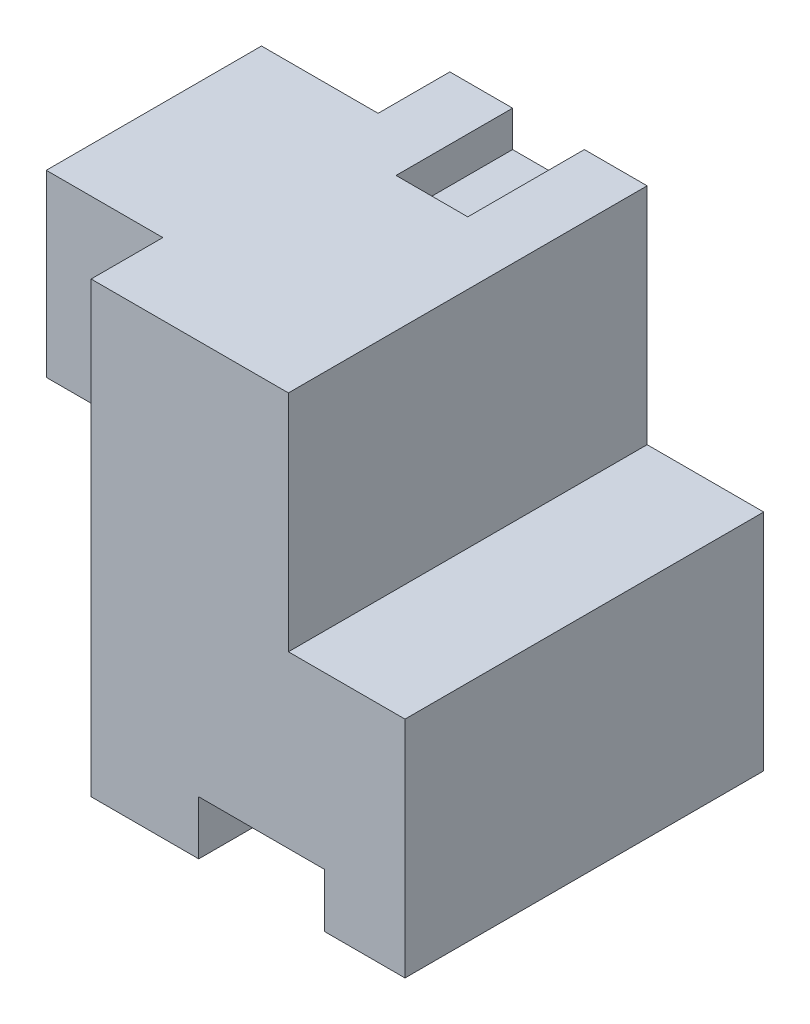
ISO-10303-21;
HEADER;
FILE_DESCRIPTION(('STEP AP214'),'2;1');
FILE_NAME('part.step','',(''),(''),'','','');
FILE_SCHEMA(('AUTOMOTIVE_DESIGN { 1 0 10303 214 1 1 1 1 }'));
ENDSEC;
DATA;
#1=APPLICATION_CONTEXT('core data for automotive mechanical design processes');
#2=APPLICATION_PROTOCOL_DEFINITION('international standard','automotive_design',2000,#1);
#3=PRODUCT_CONTEXT('',#1,'mechanical');
#4=PRODUCT('Part','Part','',(#3));
#5=PRODUCT_RELATED_PRODUCT_CATEGORY('part','',(#4));
#6=PRODUCT_DEFINITION_FORMATION('','',#4);
#7=PRODUCT_DEFINITION_CONTEXT('part definition',#1,'design');
#8=PRODUCT_DEFINITION('design','',#6,#7);
#9=PRODUCT_DEFINITION_SHAPE('','',#8);
#10=(LENGTH_UNIT() NAMED_UNIT(*) SI_UNIT(.MILLI.,.METRE.));
#11=(NAMED_UNIT(*) PLANE_ANGLE_UNIT() SI_UNIT($,.RADIAN.));
#12=(NAMED_UNIT(*) SI_UNIT($,.STERADIAN.) SOLID_ANGLE_UNIT());
#13=UNCERTAINTY_MEASURE_WITH_UNIT(LENGTH_MEASURE(1.E-05),#10,'distance_accuracy_value','');
#14=(GEOMETRIC_REPRESENTATION_CONTEXT(3) GLOBAL_UNCERTAINTY_ASSIGNED_CONTEXT((#13)) GLOBAL_UNIT_ASSIGNED_CONTEXT((#10,
#11,#12)) REPRESENTATION_CONTEXT('',''));
#15=CARTESIAN_POINT('',(0.,0.,0.));
#16=DIRECTION('',(0.,0.,1.));
#17=DIRECTION('',(1.,0.,0.));
#18=AXIS2_PLACEMENT_3D('',#15,#16,#17);
#19=CARTESIAN_POINT('',(-17.5,0.,-20.));
#20=DIRECTION('',(1.,0.,0.));
#21=DIRECTION('',(0.,0.,-1.));
#22=AXIS2_PLACEMENT_3D('',#19,#20,#21);
#23=PLANE('',#22);
#24=DIRECTION('',(0.,1.,0.));
#25=VECTOR('',#24,1.);
#26=CARTESIAN_POINT('',(-17.5,0.,12.));
#27=LINE('',#26,#25);
#28=CARTESIAN_POINT('',(-17.5,5.,12.));
#29=VERTEX_POINT('',#28);
#30=CARTESIAN_POINT('',(-17.5,25.,12.));
#31=VERTEX_POINT('',#30);
#32=EDGE_CURVE('E42',#29,#31,#27,.T.);
#33=ORIENTED_EDGE('',*,*,#32,.F.);
#34=DIRECTION('',(0.,0.,-1.));
#35=VECTOR('',#34,1.);
#36=CARTESIAN_POINT('',(-17.5,5.,43.8537208837531));
#37=LINE('',#36,#35);
#38=CARTESIAN_POINT('',(-17.5,5.,-12.));
#39=VERTEX_POINT('',#38);
#40=EDGE_CURVE('E241',#29,#39,#37,.T.);
#41=ORIENTED_EDGE('',*,*,#40,.T.);
#42=DIRECTION('',(0.,-1.,0.));
#43=VECTOR('',#42,1.);
#44=CARTESIAN_POINT('',(-17.5,0.,-12.));
#45=LINE('',#44,#43);
#46=CARTESIAN_POINT('',(-17.5,25.,-12.));
#47=VERTEX_POINT('',#46);
#48=EDGE_CURVE('E224',#47,#39,#45,.T.);
#49=ORIENTED_EDGE('',*,*,#48,.F.);
#50=DIRECTION('',(0.,0.,1.));
#51=VECTOR('',#50,1.);
#52=CARTESIAN_POINT('',(-17.5,25.,-20.));
#53=LINE('',#52,#51);
#54=CARTESIAN_POINT('',(-17.5,25.,-20.));
#55=VERTEX_POINT('',#54);
#56=EDGE_CURVE('E283',#55,#47,#53,.T.);
#57=ORIENTED_EDGE('',*,*,#56,.F.);
#58=DIRECTION('',(0.,1.,0.));
#59=VECTOR('',#58,1.);
#60=CARTESIAN_POINT('',(-17.5,0.,-20.));
#61=LINE('',#60,#59);
#62=CARTESIAN_POINT('',(-17.5,-25.,-20.));
#63=VERTEX_POINT('',#62);
#64=EDGE_CURVE('E265',#63,#55,#61,.T.);
#65=ORIENTED_EDGE('',*,*,#64,.F.);
#66=DIRECTION('',(0.,0.,1.));
#67=VECTOR('',#66,1.);
#68=CARTESIAN_POINT('',(-17.5,-25.,-20.));
#69=LINE('',#68,#67);
#70=CARTESIAN_POINT('',(-17.5,-25.,20.));
#71=VERTEX_POINT('',#70);
#72=EDGE_CURVE('E281',#63,#71,#69,.T.);
#73=ORIENTED_EDGE('',*,*,#72,.T.);
#74=DIRECTION('',(0.,1.,0.));
#75=VECTOR('',#74,1.);
#76=CARTESIAN_POINT('',(-17.5,0.,20.));
#77=LINE('',#76,#75);
#78=CARTESIAN_POINT('',(-17.5,25.,20.));
#79=VERTEX_POINT('',#78);
#80=EDGE_CURVE('E248',#71,#79,#77,.T.);
#81=ORIENTED_EDGE('',*,*,#80,.T.);
#82=EDGE_CURVE('E289',#31,#79,#53,.T.);
#83=ORIENTED_EDGE('',*,*,#82,.F.);
#84=EDGE_LOOP('',(#33,#41,#49,#57,#65,#73,#81,#83));
#85=FACE_BOUND('',#84,.T.);
#86=ADVANCED_FACE('F38',(#85),#23,.F.);
#87=CARTESIAN_POINT('',(4.5,0.,-20.));
#88=DIRECTION('',(-1.,0.,0.));
#89=DIRECTION('',(0.,-1.,0.));
#90=AXIS2_PLACEMENT_3D('',#87,#88,#89);
#91=PLANE('',#90);
#92=DIRECTION('',(0.,0.,1.));
#93=VECTOR('',#92,1.);
#94=CARTESIAN_POINT('',(4.5,25.,-20.));
#95=LINE('',#94,#93);
#96=CARTESIAN_POINT('',(4.5,25.,-20.));
#97=VERTEX_POINT('',#96);
#98=CARTESIAN_POINT('',(4.5,25.,20.));
#99=VERTEX_POINT('',#98);
#100=EDGE_CURVE('E275',#97,#99,#95,.T.);
#101=ORIENTED_EDGE('',*,*,#100,.T.);
#102=DIRECTION('',(0.,-1.,0.));
#103=VECTOR('',#102,1.);
#104=CARTESIAN_POINT('',(4.5,0.,20.));
#105=LINE('',#104,#103);
#106=CARTESIAN_POINT('',(4.5,0.,20.));
#107=VERTEX_POINT('',#106);
#108=EDGE_CURVE('E235',#99,#107,#105,.T.);
#109=ORIENTED_EDGE('',*,*,#108,.T.);
#110=DIRECTION('',(0.,0.,1.));
#111=VECTOR('',#110,1.);
#112=CARTESIAN_POINT('',(4.5,0.,-20.));
#113=LINE('',#112,#111);
#114=CARTESIAN_POINT('',(4.5,0.,-20.));
#115=VERTEX_POINT('',#114);
#116=EDGE_CURVE('E12',#115,#107,#113,.T.);
#117=ORIENTED_EDGE('',*,*,#116,.F.);
#118=DIRECTION('',(0.,-1.,0.));
#119=VECTOR('',#118,1.);
#120=CARTESIAN_POINT('',(4.5,0.,-20.));
#121=LINE('',#120,#119);
#122=EDGE_CURVE('E261',#97,#115,#121,.T.);
#123=ORIENTED_EDGE('',*,*,#122,.F.);
#124=EDGE_LOOP('',(#101,#109,#117,#123));
#125=FACE_BOUND('',#124,.T.);
#126=ADVANCED_FACE('F40',(#125),#91,.F.);
#127=CARTESIAN_POINT('',(0.,0.,-20.));
#128=DIRECTION('',(0.,1.,0.));
#129=DIRECTION('',(-1.,0.,0.));
#130=AXIS2_PLACEMENT_3D('',#127,#128,#129);
#131=PLANE('',#130);
#132=ORIENTED_EDGE('',*,*,#116,.T.);
#133=DIRECTION('',(-1.,0.,0.));
#134=VECTOR('',#133,1.);
#135=CARTESIAN_POINT('',(0.,0.,20.));
#136=LINE('',#135,#134);
#137=CARTESIAN_POINT('',(17.5,0.,20.));
#138=VERTEX_POINT('',#137);
#139=EDGE_CURVE('E258',#138,#107,#136,.T.);
#140=ORIENTED_EDGE('',*,*,#139,.F.);
#141=DIRECTION('',(0.,0.,1.));
#142=VECTOR('',#141,1.);
#143=CARTESIAN_POINT('',(17.5,0.,-20.));
#144=LINE('',#143,#142);
#145=CARTESIAN_POINT('',(17.5,0.,-20.));
#146=VERTEX_POINT('',#145);
#147=EDGE_CURVE('E48',#146,#138,#144,.T.);
#148=ORIENTED_EDGE('',*,*,#147,.F.);
#149=DIRECTION('',(-1.,0.,0.));
#150=VECTOR('',#149,1.);
#151=CARTESIAN_POINT('',(0.,0.,-20.));
#152=LINE('',#151,#150);
#153=EDGE_CURVE('E273',#146,#115,#152,.T.);
#154=ORIENTED_EDGE('',*,*,#153,.T.);
#155=EDGE_LOOP('',(#132,#140,#148,#154));
#156=FACE_BOUND('',#155,.T.);
#157=ADVANCED_FACE('F327',(#156),#131,.T.);
#158=CARTESIAN_POINT('',(17.5,0.,-20.));
#159=DIRECTION('',(1.,0.,0.));
#160=DIRECTION('',(0.,0.,-1.));
#161=AXIS2_PLACEMENT_3D('',#158,#159,#160);
#162=PLANE('',#161);
#163=ORIENTED_EDGE('',*,*,#147,.T.);
#164=DIRECTION('',(0.,1.,0.));
#165=VECTOR('',#164,1.);
#166=CARTESIAN_POINT('',(17.5,0.,20.));
#167=LINE('',#166,#165);
#168=CARTESIAN_POINT('',(17.5,-25.,20.));
#169=VERTEX_POINT('',#168);
#170=EDGE_CURVE('E255',#169,#138,#167,.T.);
#171=ORIENTED_EDGE('',*,*,#170,.F.);
#172=DIRECTION('',(0.,0.,1.));
#173=VECTOR('',#172,1.);
#174=CARTESIAN_POINT('',(17.5,-25.,-20.));
#175=LINE('',#174,#173);
#176=CARTESIAN_POINT('',(17.5,-25.,-20.));
#177=VERTEX_POINT('',#176);
#178=EDGE_CURVE('E278',#177,#169,#175,.T.);
#179=ORIENTED_EDGE('',*,*,#178,.F.);
#180=DIRECTION('',(0.,1.,0.));
#181=VECTOR('',#180,1.);
#182=CARTESIAN_POINT('',(17.5,0.,-20.));
#183=LINE('',#182,#181);
#184=EDGE_CURVE('E270',#177,#146,#183,.T.);
#185=ORIENTED_EDGE('',*,*,#184,.T.);
#186=EDGE_LOOP('',(#163,#171,#179,#185));
#187=FACE_BOUND('',#186,.T.);
#188=ADVANCED_FACE('F318',(#187),#162,.T.);
#189=CARTESIAN_POINT('',(0.,-25.,-20.));
#190=DIRECTION('',(0.,-1.,0.));
#191=DIRECTION('',(0.,0.,-1.));
#192=AXIS2_PLACEMENT_3D('',#189,#190,#191);
#193=PLANE('',#192);
#194=DIRECTION('',(0.,0.,1.));
#195=VECTOR('',#194,1.);
#196=CARTESIAN_POINT('',(-5.50000000000001,-25.,12.));
#197=LINE('',#196,#195);
#198=CARTESIAN_POINT('',(-5.50000000000001,-25.,12.));
#199=VERTEX_POINT('',#198);
#200=CARTESIAN_POINT('',(-5.50000000000001,-25.,20.));
#201=VERTEX_POINT('',#200);
#202=EDGE_CURVE('E207',#199,#201,#197,.T.);
#203=ORIENTED_EDGE('',*,*,#202,.T.);
#204=DIRECTION('',(1.,0.,0.));
#205=VECTOR('',#204,1.);
#206=CARTESIAN_POINT('',(0.,-25.,20.));
#207=LINE('',#206,#205);
#208=EDGE_CURVE('E252',#71,#201,#207,.T.);
#209=ORIENTED_EDGE('',*,*,#208,.F.);
#210=ORIENTED_EDGE('',*,*,#72,.F.);
#211=DIRECTION('',(1.,0.,0.));
#212=VECTOR('',#211,1.);
#213=CARTESIAN_POINT('',(0.,-25.,-20.));
#214=LINE('',#213,#212);
#215=EDGE_CURVE('E267',#63,#177,#214,.T.);
#216=ORIENTED_EDGE('',*,*,#215,.T.);
#217=ORIENTED_EDGE('',*,*,#178,.T.);
#218=CARTESIAN_POINT('',(8.49999999999999,-25.,20.));
#219=VERTEX_POINT('',#218);
#220=EDGE_CURVE('E251',#219,#169,#207,.T.);
#221=ORIENTED_EDGE('',*,*,#220,.F.);
#222=DIRECTION('',(0.,0.,1.));
#223=VECTOR('',#222,1.);
#224=CARTESIAN_POINT('',(8.49999999999999,-25.,12.));
#225=LINE('',#224,#223);
#226=CARTESIAN_POINT('',(8.49999999999999,-25.,12.));
#227=VERTEX_POINT('',#226);
#228=EDGE_CURVE('E64',#227,#219,#225,.T.);
#229=ORIENTED_EDGE('',*,*,#228,.F.);
#230=DIRECTION('',(1.,0.,0.));
#231=VECTOR('',#230,1.);
#232=CARTESIAN_POINT('',(-5.50000000000001,-25.,12.));
#233=LINE('',#232,#231);
#234=EDGE_CURVE('E197',#199,#227,#233,.T.);
#235=ORIENTED_EDGE('',*,*,#234,.F.);
#236=EDGE_LOOP('',(#203,#209,#210,#216,#217,#221,#229,#235));
#237=FACE_BOUND('',#236,.T.);
#238=ADVANCED_FACE('F312',(#237),#193,.T.);
#239=CARTESIAN_POINT('',(0.,25.,-20.));
#240=DIRECTION('',(0.,-1.,0.));
#241=DIRECTION('',(0.,0.,-1.));
#242=AXIS2_PLACEMENT_3D('',#239,#240,#241);
#243=PLANE('',#242);
#244=DIRECTION('',(1.,0.,0.));
#245=VECTOR('',#244,1.);
#246=CARTESIAN_POINT('',(0.,25.,-20.));
#247=LINE('',#246,#245);
#248=CARTESIAN_POINT('',(-2.5,25.,-20.));
#249=VERTEX_POINT('',#248);
#250=EDGE_CURVE('E263',#249,#97,#247,.T.);
#251=ORIENTED_EDGE('',*,*,#250,.F.);
#252=DIRECTION('',(0.,0.,-1.));
#253=VECTOR('',#252,1.);
#254=CARTESIAN_POINT('',(-2.5,25.,-7.));
#255=LINE('',#254,#253);
#256=CARTESIAN_POINT('',(-2.5,25.,-7.));
#257=VERTEX_POINT('',#256);
#258=EDGE_CURVE('E506',#257,#249,#255,.T.);
#259=ORIENTED_EDGE('',*,*,#258,.F.);
#260=DIRECTION('',(1.,0.,0.));
#261=VECTOR('',#260,1.);
#262=CARTESIAN_POINT('',(-10.5,25.,-7.));
#263=LINE('',#262,#261);
#264=CARTESIAN_POINT('',(-10.5,25.,-7.));
#265=VERTEX_POINT('',#264);
#266=EDGE_CURVE('E503',#265,#257,#263,.T.);
#267=ORIENTED_EDGE('',*,*,#266,.F.);
#268=DIRECTION('',(0.,0.,1.));
#269=VECTOR('',#268,1.);
#270=CARTESIAN_POINT('',(-10.5,25.,-7.));
#271=LINE('',#270,#269);
#272=CARTESIAN_POINT('',(-10.5,25.,-20.));
#273=VERTEX_POINT('',#272);
#274=EDGE_CURVE('E504',#273,#265,#271,.T.);
#275=ORIENTED_EDGE('',*,*,#274,.F.);
#276=EDGE_CURVE('E186',#55,#273,#247,.T.);
#277=ORIENTED_EDGE('',*,*,#276,.F.);
#278=ORIENTED_EDGE('',*,*,#56,.T.);
#279=DIRECTION('',(1.,0.,0.));
#280=VECTOR('',#279,1.);
#281=CARTESIAN_POINT('',(0.,25.,-12.));
#282=LINE('',#281,#280);
#283=CARTESIAN_POINT('',(-30.5,25.,-12.));
#284=VERTEX_POINT('',#283);
#285=EDGE_CURVE('E229',#284,#47,#282,.T.);
#286=ORIENTED_EDGE('',*,*,#285,.F.);
#287=DIRECTION('',(0.,0.,-1.));
#288=VECTOR('',#287,1.);
#289=CARTESIAN_POINT('',(-30.5,25.,43.8537208837531));
#290=LINE('',#289,#288);
#291=CARTESIAN_POINT('',(-30.5,25.,12.));
#292=VERTEX_POINT('',#291);
#293=EDGE_CURVE('E228',#292,#284,#290,.T.);
#294=ORIENTED_EDGE('',*,*,#293,.F.);
#295=DIRECTION('',(-1.,0.,0.));
#296=VECTOR('',#295,1.);
#297=CARTESIAN_POINT('',(0.,25.,12.));
#298=LINE('',#297,#296);
#299=EDGE_CURVE('E236',#31,#292,#298,.T.);
#300=ORIENTED_EDGE('',*,*,#299,.F.);
#301=ORIENTED_EDGE('',*,*,#82,.T.);
#302=DIRECTION('',(1.,0.,0.));
#303=VECTOR('',#302,1.);
#304=CARTESIAN_POINT('',(0.,25.,20.));
#305=LINE('',#304,#303);
#306=EDGE_CURVE('E245',#79,#99,#305,.T.);
#307=ORIENTED_EDGE('',*,*,#306,.T.);
#308=ORIENTED_EDGE('',*,*,#100,.F.);
#309=EDGE_LOOP('',(#251,#259,#267,#275,#277,#278,#286,#294,#300,#301,#307,#308));
#310=FACE_BOUND('',#309,.T.);
#311=ADVANCED_FACE('F309',(#310),#243,.F.);
#312=CARTESIAN_POINT('',(0.,0.,-20.));
#313=DIRECTION('',(0.,0.,1.));
#314=DIRECTION('',(1.,0.,0.));
#315=AXIS2_PLACEMENT_3D('',#312,#313,#314);
#316=PLANE('',#315);
#317=DIRECTION('',(-1.,0.,0.));
#318=VECTOR('',#317,1.);
#319=CARTESIAN_POINT('',(-10.5,21.,-20.));
#320=LINE('',#319,#318);
#321=CARTESIAN_POINT('',(-2.5,21.,-20.));
#322=VERTEX_POINT('',#321);
#323=CARTESIAN_POINT('',(-10.5,21.,-20.));
#324=VERTEX_POINT('',#323);
#325=EDGE_CURVE('E176',#322,#324,#320,.T.);
#326=ORIENTED_EDGE('',*,*,#325,.F.);
#327=DIRECTION('',(0.,1.,0.));
#328=VECTOR('',#327,1.);
#329=CARTESIAN_POINT('',(-2.5,21.,-20.));
#330=LINE('',#329,#328);
#331=EDGE_CURVE('E187',#322,#249,#330,.T.);
#332=ORIENTED_EDGE('',*,*,#331,.T.);
#333=ORIENTED_EDGE('',*,*,#250,.T.);
#334=ORIENTED_EDGE('',*,*,#122,.T.);
#335=ORIENTED_EDGE('',*,*,#153,.F.);
#336=ORIENTED_EDGE('',*,*,#184,.F.);
#337=ORIENTED_EDGE('',*,*,#215,.F.);
#338=ORIENTED_EDGE('',*,*,#64,.T.);
#339=ORIENTED_EDGE('',*,*,#276,.T.);
#340=DIRECTION('',(0.,1.,0.));
#341=VECTOR('',#340,1.);
#342=CARTESIAN_POINT('',(-10.5,21.,-20.));
#343=LINE('',#342,#341);
#344=EDGE_CURVE('E171',#324,#273,#343,.T.);
#345=ORIENTED_EDGE('',*,*,#344,.F.);
#346=EDGE_LOOP('',(#326,#332,#333,#334,#335,#336,#337,#338,#339,#345));
#347=FACE_BOUND('',#346,.T.);
#348=ADVANCED_FACE('F184',(#347),#316,.F.);
#349=CARTESIAN_POINT('',(0.,0.,20.));
#350=DIRECTION('',(0.,0.,1.));
#351=DIRECTION('',(1.,0.,0.));
#352=AXIS2_PLACEMENT_3D('',#349,#350,#351);
#353=PLANE('',#352);
#354=DIRECTION('',(0.,-1.,0.));
#355=VECTOR('',#354,1.);
#356=CARTESIAN_POINT('',(-5.50000000000001,-25.,20.));
#357=LINE('',#356,#355);
#358=CARTESIAN_POINT('',(-5.50000000000001,-19.,20.));
#359=VERTEX_POINT('',#358);
#360=EDGE_CURVE('E208',#359,#201,#357,.T.);
#361=ORIENTED_EDGE('',*,*,#360,.F.);
#362=DIRECTION('',(-1.,0.,0.));
#363=VECTOR('',#362,1.);
#364=CARTESIAN_POINT('',(-5.50000000000001,-19.,20.));
#365=LINE('',#364,#363);
#366=CARTESIAN_POINT('',(8.49999999999999,-19.,20.));
#367=VERTEX_POINT('',#366);
#368=EDGE_CURVE('E198',#367,#359,#365,.T.);
#369=ORIENTED_EDGE('',*,*,#368,.F.);
#370=DIRECTION('',(0.,1.,0.));
#371=VECTOR('',#370,1.);
#372=CARTESIAN_POINT('',(8.49999999999999,-25.,20.));
#373=LINE('',#372,#371);
#374=EDGE_CURVE('E210',#219,#367,#373,.T.);
#375=ORIENTED_EDGE('',*,*,#374,.F.);
#376=ORIENTED_EDGE('',*,*,#220,.T.);
#377=ORIENTED_EDGE('',*,*,#170,.T.);
#378=ORIENTED_EDGE('',*,*,#139,.T.);
#379=ORIENTED_EDGE('',*,*,#108,.F.);
#380=ORIENTED_EDGE('',*,*,#306,.F.);
#381=ORIENTED_EDGE('',*,*,#80,.F.);
#382=ORIENTED_EDGE('',*,*,#208,.T.);
#383=EDGE_LOOP('',(#361,#369,#375,#376,#377,#378,#379,#380,#381,#382));
#384=FACE_BOUND('',#383,.T.);
#385=ADVANCED_FACE('F306',(#384),#353,.T.);
#386=CARTESIAN_POINT('',(-30.5,0.,43.8537208837531));
#387=DIRECTION('',(1.,0.,0.));
#388=DIRECTION('',(0.,1.,0.));
#389=AXIS2_PLACEMENT_3D('',#386,#387,#388);
#390=PLANE('',#389);
#391=DIRECTION('',(0.,-1.,0.));
#392=VECTOR('',#391,1.);
#393=CARTESIAN_POINT('',(-30.5,0.,12.));
#394=LINE('',#393,#392);
#395=CARTESIAN_POINT('',(-30.5,5.,12.));
#396=VERTEX_POINT('',#395);
#397=EDGE_CURVE('E233',#292,#396,#394,.T.);
#398=ORIENTED_EDGE('',*,*,#397,.F.);
#399=ORIENTED_EDGE('',*,*,#293,.T.);
#400=DIRECTION('',(0.,1.,0.));
#401=VECTOR('',#400,1.);
#402=CARTESIAN_POINT('',(-30.5,0.,-12.));
#403=LINE('',#402,#401);
#404=CARTESIAN_POINT('',(-30.5,5.,-12.));
#405=VERTEX_POINT('',#404);
#406=EDGE_CURVE('E225',#405,#284,#403,.T.);
#407=ORIENTED_EDGE('',*,*,#406,.F.);
#408=DIRECTION('',(0.,0.,-1.));
#409=VECTOR('',#408,1.);
#410=CARTESIAN_POINT('',(-30.5,5.,43.8537208837531));
#411=LINE('',#410,#409);
#412=EDGE_CURVE('E232',#396,#405,#411,.T.);
#413=ORIENTED_EDGE('',*,*,#412,.F.);
#414=EDGE_LOOP('',(#398,#399,#407,#413));
#415=FACE_BOUND('',#414,.T.);
#416=ADVANCED_FACE('F337',(#415),#390,.F.);
#417=CARTESIAN_POINT('',(0.,5.00000000000001,43.8537208837531));
#418=DIRECTION('',(0.,-1.,0.));
#419=DIRECTION('',(1.,0.,0.));
#420=AXIS2_PLACEMENT_3D('',#417,#418,#419);
#421=PLANE('',#420);
#422=ORIENTED_EDGE('',*,*,#40,.F.);
#423=DIRECTION('',(-1.,0.,0.));
#424=VECTOR('',#423,1.);
#425=CARTESIAN_POINT('',(0.,5.00000000000001,12.));
#426=LINE('',#425,#424);
#427=EDGE_CURVE('E230',#29,#396,#426,.T.);
#428=ORIENTED_EDGE('',*,*,#427,.T.);
#429=ORIENTED_EDGE('',*,*,#412,.T.);
#430=DIRECTION('',(1.,0.,0.));
#431=VECTOR('',#430,1.);
#432=CARTESIAN_POINT('',(0.,5.00000000000001,-12.));
#433=LINE('',#432,#431);
#434=EDGE_CURVE('E216',#405,#39,#433,.T.);
#435=ORIENTED_EDGE('',*,*,#434,.T.);
#436=EDGE_LOOP('',(#422,#428,#429,#435));
#437=FACE_BOUND('',#436,.T.);
#438=ADVANCED_FACE('F342',(#437),#421,.T.);
#439=CARTESIAN_POINT('',(0.,0.,12.));
#440=DIRECTION('',(0.,0.,1.));
#441=DIRECTION('',(1.,0.,0.));
#442=AXIS2_PLACEMENT_3D('',#439,#440,#441);
#443=PLANE('',#442);
#444=ORIENTED_EDGE('',*,*,#32,.T.);
#445=ORIENTED_EDGE('',*,*,#299,.T.);
#446=ORIENTED_EDGE('',*,*,#397,.T.);
#447=ORIENTED_EDGE('',*,*,#427,.F.);
#448=EDGE_LOOP('',(#444,#445,#446,#447));
#449=FACE_BOUND('',#448,.T.);
#450=ADVANCED_FACE('F338',(#449),#443,.T.);
#451=CARTESIAN_POINT('',(0.,0.,-12.));
#452=DIRECTION('',(0.,0.,1.));
#453=DIRECTION('',(1.,0.,0.));
#454=AXIS2_PLACEMENT_3D('',#451,#452,#453);
#455=PLANE('',#454);
#456=ORIENTED_EDGE('',*,*,#285,.T.);
#457=ORIENTED_EDGE('',*,*,#48,.T.);
#458=ORIENTED_EDGE('',*,*,#434,.F.);
#459=ORIENTED_EDGE('',*,*,#406,.T.);
#460=EDGE_LOOP('',(#456,#457,#458,#459));
#461=FACE_BOUND('',#460,.T.);
#462=ADVANCED_FACE('F341',(#461),#455,.F.);
#463=CARTESIAN_POINT('',(-5.50000000000001,-25.,12.));
#464=DIRECTION('',(-1.,0.,0.));
#465=DIRECTION('',(0.,0.,1.));
#466=AXIS2_PLACEMENT_3D('',#463,#464,#465);
#467=PLANE('',#466);
#468=ORIENTED_EDGE('',*,*,#360,.T.);
#469=ORIENTED_EDGE('',*,*,#202,.F.);
#470=DIRECTION('',(0.,-1.,0.));
#471=VECTOR('',#470,1.);
#472=CARTESIAN_POINT('',(-5.50000000000001,-25.,12.));
#473=LINE('',#472,#471);
#474=CARTESIAN_POINT('',(-5.50000000000001,-19.,12.));
#475=VERTEX_POINT('',#474);
#476=EDGE_CURVE('E194',#475,#199,#473,.T.);
#477=ORIENTED_EDGE('',*,*,#476,.F.);
#478=DIRECTION('',(0.,0.,1.));
#479=VECTOR('',#478,1.);
#480=CARTESIAN_POINT('',(-5.50000000000001,-19.,12.));
#481=LINE('',#480,#479);
#482=EDGE_CURVE('E214',#475,#359,#481,.T.);
#483=ORIENTED_EDGE('',*,*,#482,.T.);
#484=EDGE_LOOP('',(#468,#469,#477,#483));
#485=FACE_BOUND('',#484,.T.);
#486=ADVANCED_FACE('F352',(#485),#467,.F.);
#487=CARTESIAN_POINT('',(-5.50000000000001,-19.,12.));
#488=DIRECTION('',(0.,1.,0.));
#489=DIRECTION('',(0.,0.,1.));
#490=AXIS2_PLACEMENT_3D('',#487,#488,#489);
#491=PLANE('',#490);
#492=ORIENTED_EDGE('',*,*,#368,.T.);
#493=ORIENTED_EDGE('',*,*,#482,.F.);
#494=DIRECTION('',(-1.,0.,0.));
#495=VECTOR('',#494,1.);
#496=CARTESIAN_POINT('',(-5.50000000000001,-19.,12.));
#497=LINE('',#496,#495);
#498=CARTESIAN_POINT('',(8.49999999999999,-19.,12.));
#499=VERTEX_POINT('',#498);
#500=EDGE_CURVE('E204',#499,#475,#497,.T.);
#501=ORIENTED_EDGE('',*,*,#500,.F.);
#502=DIRECTION('',(0.,0.,1.));
#503=VECTOR('',#502,1.);
#504=CARTESIAN_POINT('',(8.49999999999999,-19.,12.));
#505=LINE('',#504,#503);
#506=EDGE_CURVE('E217',#499,#367,#505,.T.);
#507=ORIENTED_EDGE('',*,*,#506,.T.);
#508=EDGE_LOOP('',(#492,#493,#501,#507));
#509=FACE_BOUND('',#508,.T.);
#510=ADVANCED_FACE('F356',(#509),#491,.F.);
#511=CARTESIAN_POINT('',(8.49999999999999,-25.,12.));
#512=DIRECTION('',(1.,0.,0.));
#513=DIRECTION('',(0.,0.,-1.));
#514=AXIS2_PLACEMENT_3D('',#511,#512,#513);
#515=PLANE('',#514);
#516=ORIENTED_EDGE('',*,*,#374,.T.);
#517=ORIENTED_EDGE('',*,*,#506,.F.);
#518=DIRECTION('',(0.,1.,0.));
#519=VECTOR('',#518,1.);
#520=CARTESIAN_POINT('',(8.49999999999999,-25.,12.));
#521=LINE('',#520,#519);
#522=EDGE_CURVE('E201',#227,#499,#521,.T.);
#523=ORIENTED_EDGE('',*,*,#522,.F.);
#524=ORIENTED_EDGE('',*,*,#228,.T.);
#525=EDGE_LOOP('',(#516,#517,#523,#524));
#526=FACE_BOUND('',#525,.T.);
#527=ADVANCED_FACE('F358',(#526),#515,.F.);
#528=CARTESIAN_POINT('',(0.,0.,12.));
#529=DIRECTION('',(0.,0.,-1.));
#530=DIRECTION('',(-1.,0.,0.));
#531=AXIS2_PLACEMENT_3D('',#528,#529,#530);
#532=PLANE('',#531);
#533=ORIENTED_EDGE('',*,*,#476,.T.);
#534=ORIENTED_EDGE('',*,*,#234,.T.);
#535=ORIENTED_EDGE('',*,*,#522,.T.);
#536=ORIENTED_EDGE('',*,*,#500,.T.);
#537=EDGE_LOOP('',(#533,#534,#535,#536));
#538=FACE_BOUND('',#537,.T.);
#539=ADVANCED_FACE('F361',(#538),#532,.F.);
#540=CARTESIAN_POINT('',(-2.5,21.,-7.));
#541=DIRECTION('',(1.,0.,0.));
#542=DIRECTION('',(0.,0.,-1.));
#543=AXIS2_PLACEMENT_3D('',#540,#541,#542);
#544=PLANE('',#543);
#545=ORIENTED_EDGE('',*,*,#258,.T.);
#546=ORIENTED_EDGE('',*,*,#331,.F.);
#547=DIRECTION('',(0.,0.,-1.));
#548=VECTOR('',#547,1.);
#549=CARTESIAN_POINT('',(-2.5,21.,-7.));
#550=LINE('',#549,#548);
#551=CARTESIAN_POINT('',(-2.5,21.,-7.));
#552=VERTEX_POINT('',#551);
#553=EDGE_CURVE('E56',#552,#322,#550,.T.);
#554=ORIENTED_EDGE('',*,*,#553,.F.);
#555=DIRECTION('',(0.,1.,0.));
#556=VECTOR('',#555,1.);
#557=CARTESIAN_POINT('',(-2.5,21.,-7.));
#558=LINE('',#557,#556);
#559=EDGE_CURVE('E189',#552,#257,#558,.T.);
#560=ORIENTED_EDGE('',*,*,#559,.T.);
#561=EDGE_LOOP('',(#545,#546,#554,#560));
#562=FACE_BOUND('',#561,.T.);
#563=ADVANCED_FACE('F367',(#562),#544,.F.);
#564=CARTESIAN_POINT('',(-10.5,21.,-7.));
#565=DIRECTION('',(0.,0.,1.));
#566=DIRECTION('',(1.,0.,0.));
#567=AXIS2_PLACEMENT_3D('',#564,#565,#566);
#568=PLANE('',#567);
#569=ORIENTED_EDGE('',*,*,#266,.T.);
#570=ORIENTED_EDGE('',*,*,#559,.F.);
#571=DIRECTION('',(1.,0.,0.));
#572=VECTOR('',#571,1.);
#573=CARTESIAN_POINT('',(-10.5,21.,-7.));
#574=LINE('',#573,#572);
#575=CARTESIAN_POINT('',(-10.5,21.,-7.));
#576=VERTEX_POINT('',#575);
#577=EDGE_CURVE('E175',#576,#552,#574,.T.);
#578=ORIENTED_EDGE('',*,*,#577,.F.);
#579=DIRECTION('',(0.,1.,0.));
#580=VECTOR('',#579,1.);
#581=CARTESIAN_POINT('',(-10.5,21.,-7.));
#582=LINE('',#581,#580);
#583=EDGE_CURVE('E173',#576,#265,#582,.T.);
#584=ORIENTED_EDGE('',*,*,#583,.T.);
#585=EDGE_LOOP('',(#569,#570,#578,#584));
#586=FACE_BOUND('',#585,.T.);
#587=ADVANCED_FACE('F371',(#586),#568,.F.);
#588=CARTESIAN_POINT('',(-10.5,21.,-7.));
#589=DIRECTION('',(-1.,0.,0.));
#590=DIRECTION('',(0.,0.,1.));
#591=AXIS2_PLACEMENT_3D('',#588,#589,#590);
#592=PLANE('',#591);
#593=ORIENTED_EDGE('',*,*,#274,.T.);
#594=ORIENTED_EDGE('',*,*,#583,.F.);
#595=DIRECTION('',(0.,0.,1.));
#596=VECTOR('',#595,1.);
#597=CARTESIAN_POINT('',(-10.5,21.,-7.));
#598=LINE('',#597,#596);
#599=EDGE_CURVE('E167',#324,#576,#598,.T.);
#600=ORIENTED_EDGE('',*,*,#599,.F.);
#601=ORIENTED_EDGE('',*,*,#344,.T.);
#602=EDGE_LOOP('',(#593,#594,#600,#601));
#603=FACE_BOUND('',#602,.T.);
#604=ADVANCED_FACE('F169',(#603),#592,.F.);
#605=CARTESIAN_POINT('',(0.,21.,0.));
#606=DIRECTION('',(0.,-1.,0.));
#607=DIRECTION('',(0.,0.,-1.));
#608=AXIS2_PLACEMENT_3D('',#605,#606,#607);
#609=PLANE('',#608);
#610=ORIENTED_EDGE('',*,*,#553,.T.);
#611=ORIENTED_EDGE('',*,*,#325,.T.);
#612=ORIENTED_EDGE('',*,*,#599,.T.);
#613=ORIENTED_EDGE('',*,*,#577,.T.);
#614=EDGE_LOOP('',(#610,#611,#612,#613));
#615=FACE_BOUND('',#614,.T.);
#616=ADVANCED_FACE('F179',(#615),#609,.F.);
#617=CLOSED_SHELL('',(#86,#126,#157,#188,#238,#311,#348,#385,#416,#438,#450,#462,#486,#510,#527,
#539,#563,#587,#604,#616));
#618=MANIFOLD_SOLID_BREP('B2',#617);
#619=ADVANCED_BREP_SHAPE_REPRESENTATION('',(#18,#618),#14);
#620=SHAPE_DEFINITION_REPRESENTATION(#9,#619);
ENDSEC;
END-ISO-10303-21;
